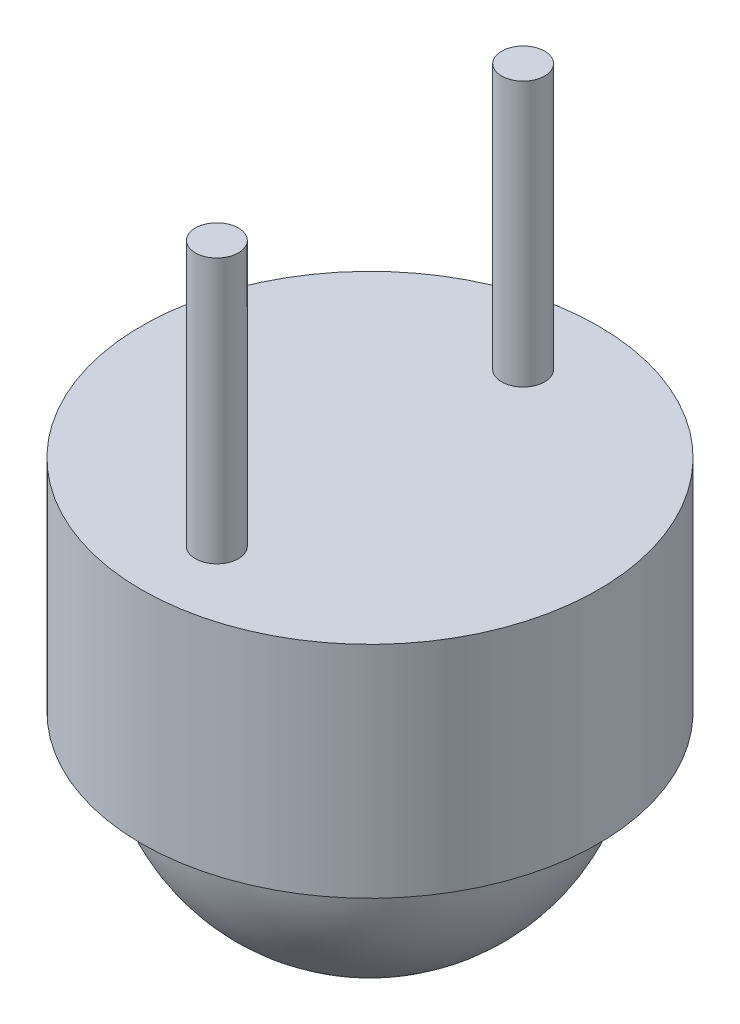
ISO-10303-21;
HEADER;
FILE_DESCRIPTION(('STEP AP214'),'2;1');
FILE_NAME('part.step','',(''),(''),'','','');
FILE_SCHEMA(('AUTOMOTIVE_DESIGN { 1 0 10303 214 1 1 1 1 }'));
ENDSEC;
DATA;
#1=APPLICATION_CONTEXT('core data for automotive mechanical design processes');
#2=APPLICATION_PROTOCOL_DEFINITION('international standard','automotive_design',2000,#1);
#3=PRODUCT_CONTEXT('',#1,'mechanical');
#4=PRODUCT('Part','Part','',(#3));
#5=PRODUCT_RELATED_PRODUCT_CATEGORY('part','',(#4));
#6=PRODUCT_DEFINITION_FORMATION('','',#4);
#7=PRODUCT_DEFINITION_CONTEXT('part definition',#1,'design');
#8=PRODUCT_DEFINITION('design','',#6,#7);
#9=PRODUCT_DEFINITION_SHAPE('','',#8);
#10=(LENGTH_UNIT() NAMED_UNIT(*) SI_UNIT(.MILLI.,.METRE.));
#11=(NAMED_UNIT(*) PLANE_ANGLE_UNIT() SI_UNIT($,.RADIAN.));
#12=(NAMED_UNIT(*) SI_UNIT($,.STERADIAN.) SOLID_ANGLE_UNIT());
#13=UNCERTAINTY_MEASURE_WITH_UNIT(LENGTH_MEASURE(1.E-05),#10,'distance_accuracy_value','');
#14=(GEOMETRIC_REPRESENTATION_CONTEXT(3) GLOBAL_UNCERTAINTY_ASSIGNED_CONTEXT((#13)) GLOBAL_UNIT_ASSIGNED_CONTEXT((#10,
#11,#12)) REPRESENTATION_CONTEXT('',''));
#15=CARTESIAN_POINT('',(0.,0.,0.));
#16=DIRECTION('',(0.,0.,1.));
#17=DIRECTION('',(1.,0.,0.));
#18=AXIS2_PLACEMENT_3D('',#15,#16,#17);
#19=CARTESIAN_POINT('',(0.,24.525,-7.747));
#20=DIRECTION('',(0.,-1.,0.));
#21=DIRECTION('',(0.,0.,-1.));
#22=AXIS2_PLACEMENT_3D('',#19,#20,#21);
#23=CYLINDRICAL_SURFACE('',#22,1.09);
#24=CARTESIAN_POINT('',(0.,24.525,-7.747));
#25=DIRECTION('',(0.,-1.,0.));
#26=DIRECTION('',(0.,0.,-1.));
#27=AXIS2_PLACEMENT_3D('',#24,#25,#26);
#28=CIRCLE('',#27,1.09);
#29=CARTESIAN_POINT('',(0.,24.525,-8.837));
#30=VERTEX_POINT('',#29);
#31=EDGE_CURVE('E58',#30,#30,#28,.T.);
#32=ORIENTED_EDGE('',*,*,#31,.T.);
#33=EDGE_LOOP('',(#32));
#34=FACE_BOUND('',#33,.T.);
#35=CARTESIAN_POINT('',(0.,9.525,-7.747));
#36=DIRECTION('',(0.,-1.,0.));
#37=DIRECTION('',(0.,0.,-1.));
#38=AXIS2_PLACEMENT_3D('',#35,#36,#37);
#39=CIRCLE('',#38,1.09);
#40=CARTESIAN_POINT('',(0.,9.525,-8.837));
#41=VERTEX_POINT('',#40);
#42=EDGE_CURVE('E11',#41,#41,#39,.T.);
#43=ORIENTED_EDGE('',*,*,#42,.F.);
#44=EDGE_LOOP('',(#43));
#45=FACE_BOUND('',#44,.T.);
#46=ADVANCED_FACE('F54',(#34,#45),#23,.T.);
#47=CARTESIAN_POINT('',(0.,24.525,-7.747));
#48=DIRECTION('',(0.,-1.,0.));
#49=DIRECTION('',(0.,0.,-1.));
#50=AXIS2_PLACEMENT_3D('',#47,#48,#49);
#51=PLANE('',#50);
#52=ORIENTED_EDGE('',*,*,#31,.F.);
#53=EDGE_LOOP('',(#52));
#54=FACE_BOUND('',#53,.T.);
#55=ADVANCED_FACE('F56',(#54),#51,.F.);
#56=CARTESIAN_POINT('',(0.,9.525,-7.747));
#57=DIRECTION('',(0.,-1.,0.));
#58=DIRECTION('',(0.,0.,-1.));
#59=AXIS2_PLACEMENT_3D('',#56,#57,#58);
#60=PLANE('',#59);
#61=ORIENTED_EDGE('',*,*,#42,.T.);
#62=EDGE_LOOP('',(#61));
#63=FACE_BOUND('',#62,.T.);
#64=ADVANCED_FACE('F70',(#63),#60,.T.);
#65=CLOSED_SHELL('',(#46,#55,#64));
#66=MANIFOLD_SOLID_BREP('B2',#65);
#67=CARTESIAN_POINT('',(0.,24.525,7.747));
#68=DIRECTION('',(0.,-1.,0.));
#69=DIRECTION('',(0.,0.,-1.));
#70=AXIS2_PLACEMENT_3D('',#67,#68,#69);
#71=CYLINDRICAL_SURFACE('',#70,1.09);
#72=CARTESIAN_POINT('',(0.,24.525,7.747));
#73=DIRECTION('',(0.,-1.,0.));
#74=DIRECTION('',(0.,0.,-1.));
#75=AXIS2_PLACEMENT_3D('',#72,#73,#74);
#76=CIRCLE('',#75,1.09);
#77=CARTESIAN_POINT('',(0.,24.525,6.657));
#78=VERTEX_POINT('',#77);
#79=EDGE_CURVE('E53',#78,#78,#76,.T.);
#80=ORIENTED_EDGE('',*,*,#79,.T.);
#81=EDGE_LOOP('',(#80));
#82=FACE_BOUND('',#81,.T.);
#83=CARTESIAN_POINT('',(0.,9.525,7.747));
#84=DIRECTION('',(0.,-1.,0.));
#85=DIRECTION('',(0.,0.,-1.));
#86=AXIS2_PLACEMENT_3D('',#83,#84,#85);
#87=CIRCLE('',#86,1.09);
#88=CARTESIAN_POINT('',(0.,9.525,6.657));
#89=VERTEX_POINT('',#88);
#90=EDGE_CURVE('E106',#89,#89,#87,.T.);
#91=ORIENTED_EDGE('',*,*,#90,.F.);
#92=EDGE_LOOP('',(#91));
#93=FACE_BOUND('',#92,.T.);
#94=ADVANCED_FACE('F103',(#82,#93),#71,.T.);
#95=CARTESIAN_POINT('',(0.,24.525,7.747));
#96=DIRECTION('',(0.,-1.,0.));
#97=DIRECTION('',(0.,0.,-1.));
#98=AXIS2_PLACEMENT_3D('',#95,#96,#97);
#99=PLANE('',#98);
#100=ORIENTED_EDGE('',*,*,#79,.F.);
#101=EDGE_LOOP('',(#100));
#102=FACE_BOUND('',#101,.T.);
#103=ADVANCED_FACE('F118',(#102),#99,.F.);
#104=CARTESIAN_POINT('',(0.,9.525,7.747));
#105=DIRECTION('',(0.,-1.,0.));
#106=DIRECTION('',(0.,0.,-1.));
#107=AXIS2_PLACEMENT_3D('',#104,#105,#106);
#108=PLANE('',#107);
#109=ORIENTED_EDGE('',*,*,#90,.T.);
#110=EDGE_LOOP('',(#109));
#111=FACE_BOUND('',#110,.T.);
#112=ADVANCED_FACE('F115',(#111),#108,.T.);
#113=CLOSED_SHELL('',(#94,#103,#112));
#114=MANIFOLD_SOLID_BREP('B6',#113);
#115=CARTESIAN_POINT('',(0.,0.,0.));
#116=DIRECTION('',(0.,1.,0.));
#117=DIRECTION('',(0.,0.,1.));
#118=AXIS2_PLACEMENT_3D('',#115,#116,#117);
#119=PLANE('',#118);
#120=CARTESIAN_POINT('',(0.,0.,0.));
#121=DIRECTION('',(0.,1.,0.));
#122=DIRECTION('',(0.,0.,1.));
#123=AXIS2_PLACEMENT_3D('',#120,#121,#122);
#124=CIRCLE('',#123,11.557);
#125=CARTESIAN_POINT('',(0.,0.,-11.557));
#126=VERTEX_POINT('',#125);
#127=EDGE_CURVE('E102',#126,#126,#124,.T.);
#128=ORIENTED_EDGE('',*,*,#127,.F.);
#129=EDGE_LOOP('',(#128));
#130=FACE_BOUND('',#129,.T.);
#131=CARTESIAN_POINT('',(0.,0.,0.));
#132=DIRECTION('',(0.,1.,0.));
#133=DIRECTION('',(0.,0.,1.));
#134=AXIS2_PLACEMENT_3D('',#131,#132,#133);
#135=CIRCLE('',#134,9.525);
#136=CARTESIAN_POINT('',(0.,0.,-9.525));
#137=VERTEX_POINT('',#136);
#138=EDGE_CURVE('E156',#137,#137,#135,.T.);
#139=ORIENTED_EDGE('',*,*,#138,.T.);
#140=EDGE_LOOP('',(#139));
#141=FACE_BOUND('',#140,.T.);
#142=ADVANCED_FACE('F149',(#130,#141),#119,.F.);
#143=CARTESIAN_POINT('',(0.,9.525,0.));
#144=DIRECTION('',(0.,-1.,0.));
#145=DIRECTION('',(0.,0.,-1.));
#146=AXIS2_PLACEMENT_3D('',#143,#144,#145);
#147=CYLINDRICAL_SURFACE('',#146,11.557);
#148=CARTESIAN_POINT('',(0.,11.125,0.));
#149=DIRECTION('',(0.,1.,0.));
#150=DIRECTION('',(0.,0.,1.));
#151=AXIS2_PLACEMENT_3D('',#148,#149,#150);
#152=CIRCLE('',#151,11.557);
#153=CARTESIAN_POINT('',(0.,11.125,-11.557));
#154=VERTEX_POINT('',#153);
#155=EDGE_CURVE('E164',#154,#154,#152,.T.);
#156=CARTESIAN_POINT('',(0.,0.,-11.557));
#157=CARTESIAN_POINT('',(0.,0.115885416666667,-11.557));
#158=CARTESIAN_POINT('',(0.,0.231770833333333,-11.557));
#159=CARTESIAN_POINT('',(0.,0.463541666666666,-11.557));
#160=CARTESIAN_POINT('',(0.,0.579427083333333,-11.557));
#161=CARTESIAN_POINT('',(0.,0.811197916666666,-11.557));
#162=CARTESIAN_POINT('',(0.,0.927083333333333,-11.557));
#163=CARTESIAN_POINT('',(0.,1.15885416666667,-11.557));
#164=CARTESIAN_POINT('',(0.,1.27473958333333,-11.557));
#165=CARTESIAN_POINT('',(0.,1.50651041666667,-11.557));
#166=CARTESIAN_POINT('',(0.,1.62239583333333,-11.557));
#167=CARTESIAN_POINT('',(0.,1.85416666666667,-11.557));
#168=CARTESIAN_POINT('',(0.,1.97005208333333,-11.557));
#169=CARTESIAN_POINT('',(0.,2.20182291666667,-11.557));
#170=CARTESIAN_POINT('',(0.,2.31770833333333,-11.557));
#171=CARTESIAN_POINT('',(0.,2.54947916666667,-11.557));
#172=CARTESIAN_POINT('',(0.,2.66536458333333,-11.557));
#173=CARTESIAN_POINT('',(0.,2.89713541666667,-11.557));
#174=CARTESIAN_POINT('',(0.,3.01302083333333,-11.557));
#175=CARTESIAN_POINT('',(0.,3.24479166666667,-11.557));
#176=CARTESIAN_POINT('',(0.,3.36067708333333,-11.557));
#177=CARTESIAN_POINT('',(0.,3.59244791666667,-11.557));
#178=CARTESIAN_POINT('',(0.,3.70833333333333,-11.557));
#179=CARTESIAN_POINT('',(0.,3.94010416666667,-11.557));
#180=CARTESIAN_POINT('',(0.,4.05598958333333,-11.557));
#181=CARTESIAN_POINT('',(0.,4.28776041666667,-11.557));
#182=CARTESIAN_POINT('',(0.,4.40364583333333,-11.557));
#183=CARTESIAN_POINT('',(0.,4.63541666666667,-11.557));
#184=CARTESIAN_POINT('',(0.,4.75130208333333,-11.557));
#185=CARTESIAN_POINT('',(0.,4.98307291666667,-11.557));
#186=CARTESIAN_POINT('',(0.,5.09895833333333,-11.557));
#187=CARTESIAN_POINT('',(0.,5.33072916666667,-11.557));
#188=CARTESIAN_POINT('',(0.,5.44661458333333,-11.557));
#189=CARTESIAN_POINT('',(0.,5.67838541666667,-11.557));
#190=CARTESIAN_POINT('',(0.,5.79427083333333,-11.557));
#191=CARTESIAN_POINT('',(0.,6.02604166666667,-11.557));
#192=CARTESIAN_POINT('',(0.,6.14192708333333,-11.557));
#193=CARTESIAN_POINT('',(0.,6.37369791666667,-11.557));
#194=CARTESIAN_POINT('',(0.,6.48958333333333,-11.557));
#195=CARTESIAN_POINT('',(0.,6.72135416666667,-11.557));
#196=CARTESIAN_POINT('',(0.,6.83723958333333,-11.557));
#197=CARTESIAN_POINT('',(0.,7.06901041666667,-11.557));
#198=CARTESIAN_POINT('',(0.,7.18489583333333,-11.557));
#199=CARTESIAN_POINT('',(0.,7.41666666666667,-11.557));
#200=CARTESIAN_POINT('',(0.,7.53255208333333,-11.557));
#201=CARTESIAN_POINT('',(0.,7.76432291666667,-11.557));
#202=CARTESIAN_POINT('',(0.,7.88020833333333,-11.557));
#203=CARTESIAN_POINT('',(0.,8.11197916666667,-11.557));
#204=CARTESIAN_POINT('',(0.,8.22786458333333,-11.557));
#205=CARTESIAN_POINT('',(0.,8.45963541666667,-11.557));
#206=CARTESIAN_POINT('',(0.,8.57552083333333,-11.557));
#207=CARTESIAN_POINT('',(0.,8.80729166666667,-11.557));
#208=CARTESIAN_POINT('',(0.,8.92317708333333,-11.557));
#209=CARTESIAN_POINT('',(0.,9.15494791666667,-11.557));
#210=CARTESIAN_POINT('',(0.,9.27083333333333,-11.557));
#211=CARTESIAN_POINT('',(0.,9.50260416666667,-11.557));
#212=CARTESIAN_POINT('',(0.,9.61848958333333,-11.557));
#213=CARTESIAN_POINT('',(0.,9.85026041666667,-11.557));
#214=CARTESIAN_POINT('',(0.,9.96614583333334,-11.557));
#215=CARTESIAN_POINT('',(0.,10.1979166666667,-11.557));
#216=CARTESIAN_POINT('',(0.,10.3138020833333,-11.557));
#217=CARTESIAN_POINT('',(0.,10.5455729166667,-11.557));
#218=CARTESIAN_POINT('',(0.,10.6614583333333,-11.557));
#219=CARTESIAN_POINT('',(0.,10.8932291666667,-11.557));
#220=CARTESIAN_POINT('',(0.,11.0091145833333,-11.557));
#221=CARTESIAN_POINT('',(0.,11.125,-11.557));
#222=B_SPLINE_CURVE_WITH_KNOTS('',3,(#156,#157,#158,#159,#160,#161,#162,#163,#164,#165,#166,
#167,#168,#169,#170,#171,#172,#173,#174,#175,#176,#177,#178,#179,#180,#181,#182,#183,#184,#185,
#186,#187,#188,#189,#190,#191,#192,#193,#194,#195,#196,#197,#198,#199,#200,#201,#202,#203,#204,
#205,#206,#207,#208,#209,#210,#211,#212,#213,#214,#215,#216,#217,#218,#219,#220,#221),
.UNSPECIFIED.,.F.,.F.,(4,2,2,2,2,2,2,2,2,2,2,2,2,2,2,2,2,2,2,2,2,2,2,2,2,2,2,2,2,2,2,2,4),(0.,
0.34765625,0.6953125,1.04296875,1.390625,1.73828125,2.0859375,2.43359375,2.78125,3.12890625,
3.4765625,3.82421875,4.171875,4.51953125,4.8671875,5.21484375,5.5625,5.91015625,6.2578125,
6.60546875,6.953125,7.30078125,7.6484375,7.99609375,8.34375,8.69140625,9.0390625,9.38671875,
9.734375,10.08203125,10.4296875,10.77734375,11.125),.UNSPECIFIED.);
#223=EDGE_CURVE('BSEAM151',#126,#154,#222,.T.);
#224=ORIENTED_EDGE('',*,*,#127,.T.);
#225=ORIENTED_EDGE('',*,*,#155,.F.);
#226=ORIENTED_EDGE('',*,*,#223,.T.);
#227=ORIENTED_EDGE('',*,*,#223,.F.);
#228=EDGE_LOOP('',(#224,#226,#225,#227));
#229=FACE_BOUND('',#228,.T.);
#230=ADVANCED_FACE('F151',(#229),#147,.T.);
#231=CARTESIAN_POINT('',(0.,9.525,0.));
#232=DIRECTION('',(0.,-1.,0.));
#233=DIRECTION('',(0.,0.,-1.));
#234=AXIS2_PLACEMENT_3D('',#231,#232,#233);
#235=CYLINDRICAL_SURFACE('',#234,9.525);
#236=CARTESIAN_POINT('',(0.,9.525,0.));
#237=DIRECTION('',(0.,1.,0.));
#238=DIRECTION('',(0.,0.,1.));
#239=AXIS2_PLACEMENT_3D('',#236,#237,#238);
#240=CIRCLE('',#239,9.525);
#241=CARTESIAN_POINT('',(0.,9.525,-9.525));
#242=VERTEX_POINT('',#241);
#243=EDGE_CURVE('E160',#242,#242,#240,.T.);
#244=CARTESIAN_POINT('',(0.,9.525,-9.525));
#245=CARTESIAN_POINT('',(0.,9.42578125,-9.525));
#246=CARTESIAN_POINT('',(0.,9.3265625,-9.525));
#247=CARTESIAN_POINT('',(0.,9.128125,-9.525));
#248=CARTESIAN_POINT('',(0.,9.02890625,-9.525));
#249=CARTESIAN_POINT('',(0.,8.83046875,-9.525));
#250=CARTESIAN_POINT('',(0.,8.73125,-9.525));
#251=CARTESIAN_POINT('',(0.,8.5328125,-9.525));
#252=CARTESIAN_POINT('',(0.,8.43359375,-9.525));
#253=CARTESIAN_POINT('',(0.,8.23515625,-9.525));
#254=CARTESIAN_POINT('',(0.,8.1359375,-9.525));
#255=CARTESIAN_POINT('',(0.,7.9375,-9.525));
#256=CARTESIAN_POINT('',(0.,7.83828125,-9.525));
#257=CARTESIAN_POINT('',(0.,7.63984375,-9.525));
#258=CARTESIAN_POINT('',(0.,7.540625,-9.525));
#259=CARTESIAN_POINT('',(0.,7.3421875,-9.525));
#260=CARTESIAN_POINT('',(0.,7.24296875,-9.525));
#261=CARTESIAN_POINT('',(0.,7.04453125,-9.525));
#262=CARTESIAN_POINT('',(0.,6.9453125,-9.525));
#263=CARTESIAN_POINT('',(0.,6.746875,-9.525));
#264=CARTESIAN_POINT('',(0.,6.64765625,-9.525));
#265=CARTESIAN_POINT('',(0.,6.44921875,-9.525));
#266=CARTESIAN_POINT('',(0.,6.35,-9.525));
#267=CARTESIAN_POINT('',(0.,6.1515625,-9.525));
#268=CARTESIAN_POINT('',(0.,6.05234375,-9.525));
#269=CARTESIAN_POINT('',(0.,5.85390625,-9.525));
#270=CARTESIAN_POINT('',(0.,5.7546875,-9.525));
#271=CARTESIAN_POINT('',(0.,5.55625,-9.525));
#272=CARTESIAN_POINT('',(0.,5.45703125,-9.525));
#273=CARTESIAN_POINT('',(0.,5.25859375,-9.525));
#274=CARTESIAN_POINT('',(0.,5.159375,-9.525));
#275=CARTESIAN_POINT('',(0.,4.9609375,-9.525));
#276=CARTESIAN_POINT('',(0.,4.86171875,-9.525));
#277=CARTESIAN_POINT('',(0.,4.66328125,-9.525));
#278=CARTESIAN_POINT('',(0.,4.5640625,-9.525));
#279=CARTESIAN_POINT('',(0.,4.365625,-9.525));
#280=CARTESIAN_POINT('',(0.,4.26640625,-9.525));
#281=CARTESIAN_POINT('',(0.,4.06796875,-9.525));
#282=CARTESIAN_POINT('',(0.,3.96875,-9.525));
#283=CARTESIAN_POINT('',(0.,3.7703125,-9.525));
#284=CARTESIAN_POINT('',(0.,3.67109375,-9.525));
#285=CARTESIAN_POINT('',(0.,3.47265625,-9.525));
#286=CARTESIAN_POINT('',(0.,3.3734375,-9.525));
#287=CARTESIAN_POINT('',(0.,3.175,-9.525));
#288=CARTESIAN_POINT('',(0.,3.07578125,-9.525));
#289=CARTESIAN_POINT('',(0.,2.87734375,-9.525));
#290=CARTESIAN_POINT('',(0.,2.778125,-9.525));
#291=CARTESIAN_POINT('',(0.,2.5796875,-9.525));
#292=CARTESIAN_POINT('',(0.,2.48046875,-9.525));
#293=CARTESIAN_POINT('',(0.,2.28203125,-9.525));
#294=CARTESIAN_POINT('',(0.,2.1828125,-9.525));
#295=CARTESIAN_POINT('',(0.,1.984375,-9.525));
#296=CARTESIAN_POINT('',(0.,1.88515625,-9.525));
#297=CARTESIAN_POINT('',(0.,1.68671875,-9.525));
#298=CARTESIAN_POINT('',(0.,1.5875,-9.525));
#299=CARTESIAN_POINT('',(0.,1.3890625,-9.525));
#300=CARTESIAN_POINT('',(0.,1.28984375,-9.525));
#301=CARTESIAN_POINT('',(0.,1.09140625,-9.525));
#302=CARTESIAN_POINT('',(0.,0.992187500000001,-9.525));
#303=CARTESIAN_POINT('',(0.,0.793750000000001,-9.525));
#304=CARTESIAN_POINT('',(0.,0.69453125,-9.525));
#305=CARTESIAN_POINT('',(0.,0.49609375,-9.525));
#306=CARTESIAN_POINT('',(0.,0.396875,-9.525));
#307=CARTESIAN_POINT('',(0.,0.1984375,-9.525));
#308=CARTESIAN_POINT('',(0.,0.0992187500000001,-9.525));
#309=CARTESIAN_POINT('',(0.,0.,-9.525));
#310=B_SPLINE_CURVE_WITH_KNOTS('',3,(#244,#245,#246,#247,#248,#249,#250,#251,#252,#253,#254,
#255,#256,#257,#258,#259,#260,#261,#262,#263,#264,#265,#266,#267,#268,#269,#270,#271,#272,#273,
#274,#275,#276,#277,#278,#279,#280,#281,#282,#283,#284,#285,#286,#287,#288,#289,#290,#291,#292,
#293,#294,#295,#296,#297,#298,#299,#300,#301,#302,#303,#304,#305,#306,#307,#308,#309),
.UNSPECIFIED.,.F.,.F.,(4,2,2,2,2,2,2,2,2,2,2,2,2,2,2,2,2,2,2,2,2,2,2,2,2,2,2,2,2,2,2,2,4),(0.,
0.29765625,0.5953125,0.892968750000001,1.190625,1.48828125,1.7859375,2.08359375,2.38125,
2.67890625,2.9765625,3.27421875,3.571875,3.86953125,4.1671875,4.46484375,4.7625,5.06015625,
5.3578125,5.65546875,5.953125,6.25078125,6.5484375,6.84609375,7.14375,7.44140625,7.7390625,
8.03671875,8.334375,8.63203125,8.9296875,9.22734375,9.525),.UNSPECIFIED.);
#311=EDGE_CURVE('BSEAM196',#242,#137,#310,.T.);
#312=ORIENTED_EDGE('',*,*,#243,.T.);
#313=ORIENTED_EDGE('',*,*,#138,.F.);
#314=ORIENTED_EDGE('',*,*,#311,.T.);
#315=ORIENTED_EDGE('',*,*,#311,.F.);
#316=EDGE_LOOP('',(#312,#314,#313,#315));
#317=FACE_BOUND('',#316,.T.);
#318=ADVANCED_FACE('F196',(#317),#235,.F.);
#319=CARTESIAN_POINT('',(0.,9.525,0.));
#320=DIRECTION('',(0.,1.,0.));
#321=DIRECTION('',(0.,0.,1.));
#322=AXIS2_PLACEMENT_3D('',#319,#320,#321);
#323=PLANE('',#322);
#324=CARTESIAN_POINT('',(0.,9.525,-7.747));
#325=DIRECTION('',(0.,1.,0.));
#326=DIRECTION('',(0.,0.,1.));
#327=AXIS2_PLACEMENT_3D('',#324,#325,#326);
#328=CIRCLE('',#327,1.09);
#329=CARTESIAN_POINT('',(0.,9.525,-6.657));
#330=VERTEX_POINT('',#329);
#331=EDGE_CURVE('E169',#330,#330,#328,.F.);
#332=ORIENTED_EDGE('',*,*,#331,.F.);
#333=EDGE_LOOP('',(#332));
#334=FACE_BOUND('',#333,.T.);
#335=CARTESIAN_POINT('',(0.,9.525,7.747));
#336=DIRECTION('',(0.,1.,0.));
#337=DIRECTION('',(0.,0.,1.));
#338=AXIS2_PLACEMENT_3D('',#335,#336,#337);
#339=CIRCLE('',#338,1.09);
#340=CARTESIAN_POINT('',(0.,9.525,8.837));
#341=VERTEX_POINT('',#340);
#342=EDGE_CURVE('E174',#341,#341,#339,.F.);
#343=ORIENTED_EDGE('',*,*,#342,.F.);
#344=EDGE_LOOP('',(#343));
#345=FACE_BOUND('',#344,.T.);
#346=ORIENTED_EDGE('',*,*,#243,.F.);
#347=EDGE_LOOP('',(#346));
#348=FACE_BOUND('',#347,.T.);
#349=ADVANCED_FACE('F189',(#334,#345,#348),#323,.F.);
#350=CARTESIAN_POINT('',(0.,11.125,0.));
#351=DIRECTION('',(0.,1.,0.));
#352=DIRECTION('',(0.,0.,1.));
#353=AXIS2_PLACEMENT_3D('',#350,#351,#352);
#354=PLANE('',#353);
#355=CARTESIAN_POINT('',(0.,11.125,-7.747));
#356=DIRECTION('',(0.,1.,0.));
#357=DIRECTION('',(0.,0.,1.));
#358=AXIS2_PLACEMENT_3D('',#355,#356,#357);
#359=CIRCLE('',#358,1.09);
#360=CARTESIAN_POINT('',(0.,11.125,-6.657));
#361=VERTEX_POINT('',#360);
#362=EDGE_CURVE('E173',#361,#361,#359,.T.);
#363=ORIENTED_EDGE('',*,*,#362,.F.);
#364=EDGE_LOOP('',(#363));
#365=FACE_BOUND('',#364,.T.);
#366=CARTESIAN_POINT('',(0.,11.125,7.747));
#367=DIRECTION('',(0.,1.,0.));
#368=DIRECTION('',(0.,0.,1.));
#369=AXIS2_PLACEMENT_3D('',#366,#367,#368);
#370=CIRCLE('',#369,1.09);
#371=CARTESIAN_POINT('',(0.,11.125,8.837));
#372=VERTEX_POINT('',#371);
#373=EDGE_CURVE('E170',#372,#372,#370,.T.);
#374=ORIENTED_EDGE('',*,*,#373,.F.);
#375=EDGE_LOOP('',(#374));
#376=FACE_BOUND('',#375,.T.);
#377=ORIENTED_EDGE('',*,*,#155,.T.);
#378=EDGE_LOOP('',(#377));
#379=FACE_BOUND('',#378,.T.);
#380=ADVANCED_FACE('F185',(#365,#376,#379),#354,.T.);
#381=CARTESIAN_POINT('',(0.,-9.526,7.747));
#382=DIRECTION('',(0.,1.,0.));
#383=DIRECTION('',(0.,0.,1.));
#384=AXIS2_PLACEMENT_3D('',#381,#382,#383);
#385=CYLINDRICAL_SURFACE('',#384,1.09);
#386=ORIENTED_EDGE('',*,*,#373,.T.);
#387=EDGE_LOOP('',(#386));
#388=FACE_BOUND('',#387,.T.);
#389=ORIENTED_EDGE('',*,*,#342,.T.);
#390=EDGE_LOOP('',(#389));
#391=FACE_BOUND('',#390,.T.);
#392=ADVANCED_FACE('F188',(#388,#391),#385,.F.);
#393=CARTESIAN_POINT('',(0.,-9.526,-7.747));
#394=DIRECTION('',(0.,1.,0.));
#395=DIRECTION('',(0.,0.,1.));
#396=AXIS2_PLACEMENT_3D('',#393,#394,#395);
#397=CYLINDRICAL_SURFACE('',#396,1.09);
#398=ORIENTED_EDGE('',*,*,#362,.T.);
#399=EDGE_LOOP('',(#398));
#400=FACE_BOUND('',#399,.T.);
#401=ORIENTED_EDGE('',*,*,#331,.T.);
#402=EDGE_LOOP('',(#401));
#403=FACE_BOUND('',#402,.T.);
#404=ADVANCED_FACE('F182',(#400,#403),#397,.F.);
#405=CLOSED_SHELL('',(#142,#230,#318,#349,#380,#392,#404));
#406=MANIFOLD_SOLID_BREP('B48',#405);
#407=CARTESIAN_POINT('',(0.,0.,0.));
#408=DIRECTION('',(0.,-1.,0.));
#409=DIRECTION('',(-1.,0.,0.));
#410=AXIS2_PLACEMENT_3D('',#407,#408,#409);
#411=SPHERICAL_SURFACE('',#410,9.525);
#412=CARTESIAN_POINT('',(0.,-9.525,0.));
#413=VERTEX_POINT('',#412);
#414=VERTEX_LOOP('',#413);
#415=FACE_BOUND('',#414,.T.);
#416=ADVANCED_FACE('F265',(#415),#411,.T.);
#417=CLOSED_SHELL('',(#416));
#418=MANIFOLD_SOLID_BREP('B97',#417);
#419=ADVANCED_BREP_SHAPE_REPRESENTATION('',(#18,#66,#114,#406,#418),#14);
#420=SHAPE_DEFINITION_REPRESENTATION(#9,#419);
ENDSEC;
END-ISO-10303-21;
